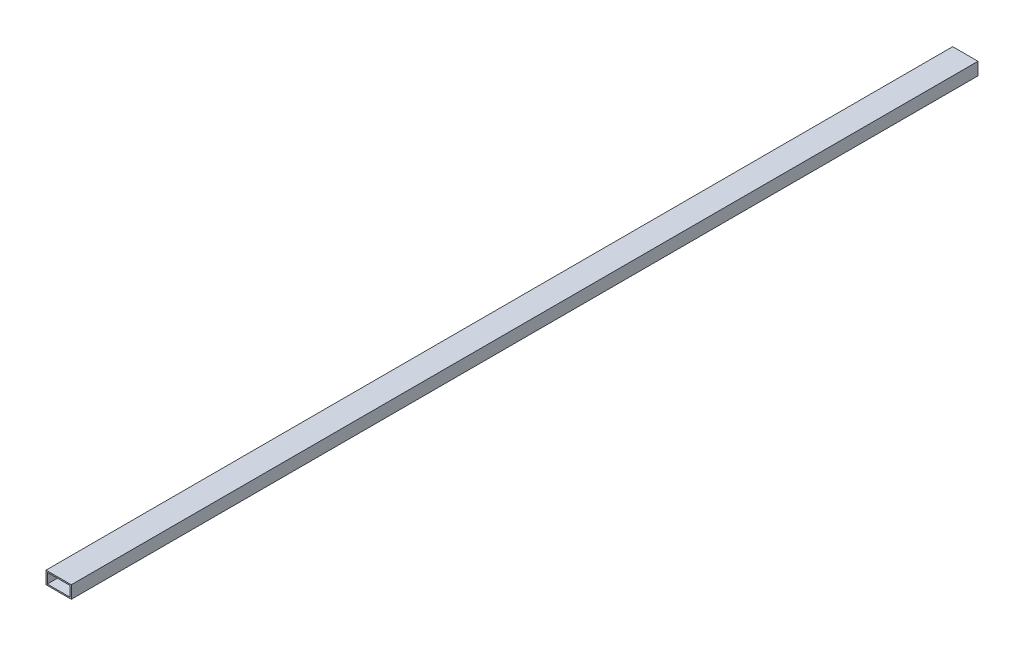
ISO-10303-21;
HEADER;
FILE_DESCRIPTION(('STEP AP214'),'2;1');
FILE_NAME('part.step','',(''),(''),'','','');
FILE_SCHEMA(('AUTOMOTIVE_DESIGN { 1 0 10303 214 1 1 1 1 }'));
ENDSEC;
DATA;
#1=APPLICATION_CONTEXT('core data for automotive mechanical design processes');
#2=APPLICATION_PROTOCOL_DEFINITION('international standard','automotive_design',2000,#1);
#3=PRODUCT_CONTEXT('',#1,'mechanical');
#4=PRODUCT('Part','Part','',(#3));
#5=PRODUCT_RELATED_PRODUCT_CATEGORY('part','',(#4));
#6=PRODUCT_DEFINITION_FORMATION('','',#4);
#7=PRODUCT_DEFINITION_CONTEXT('part definition',#1,'design');
#8=PRODUCT_DEFINITION('design','',#6,#7);
#9=PRODUCT_DEFINITION_SHAPE('','',#8);
#10=(LENGTH_UNIT() NAMED_UNIT(*) SI_UNIT(.MILLI.,.METRE.));
#11=(NAMED_UNIT(*) PLANE_ANGLE_UNIT() SI_UNIT($,.RADIAN.));
#12=(NAMED_UNIT(*) SI_UNIT($,.STERADIAN.) SOLID_ANGLE_UNIT());
#13=UNCERTAINTY_MEASURE_WITH_UNIT(LENGTH_MEASURE(1.E-05),#10,'distance_accuracy_value','');
#14=(GEOMETRIC_REPRESENTATION_CONTEXT(3) GLOBAL_UNCERTAINTY_ASSIGNED_CONTEXT((#13)) GLOBAL_UNIT_ASSIGNED_CONTEXT((#10,
#11,#12)) REPRESENTATION_CONTEXT('',''));
#15=CARTESIAN_POINT('',(0.,0.,0.));
#16=DIRECTION('',(0.,0.,1.));
#17=DIRECTION('',(1.,0.,0.));
#18=AXIS2_PLACEMENT_3D('',#15,#16,#17);
#19=CARTESIAN_POINT('',(-20.,-10.,1433.));
#20=DIRECTION('',(0.,0.,1.));
#21=DIRECTION('',(1.,0.,0.));
#22=AXIS2_PLACEMENT_3D('',#19,#20,#21);
#23=PLANE('',#22);
#24=DIRECTION('',(0.,-1.,0.));
#25=VECTOR('',#24,1.);
#26=CARTESIAN_POINT('',(-20.,-10.,1433.));
#27=LINE('',#26,#25);
#28=CARTESIAN_POINT('',(-20.,10.,1433.));
#29=VERTEX_POINT('',#28);
#30=CARTESIAN_POINT('',(-20.,-10.,1433.));
#31=VERTEX_POINT('',#30);
#32=EDGE_CURVE('E156',#29,#31,#27,.T.);
#33=ORIENTED_EDGE('',*,*,#32,.T.);
#34=DIRECTION('',(1.,0.,0.));
#35=VECTOR('',#34,1.);
#36=CARTESIAN_POINT('',(20.,-10.,1433.));
#37=LINE('',#36,#35);
#38=CARTESIAN_POINT('',(20.,-10.,1433.));
#39=VERTEX_POINT('',#38);
#40=EDGE_CURVE('E159',#31,#39,#37,.T.);
#41=ORIENTED_EDGE('',*,*,#40,.T.);
#42=DIRECTION('',(0.,1.,0.));
#43=VECTOR('',#42,1.);
#44=CARTESIAN_POINT('',(20.,-10.,1433.));
#45=LINE('',#44,#43);
#46=CARTESIAN_POINT('',(20.,10.,1433.));
#47=VERTEX_POINT('',#46);
#48=EDGE_CURVE('E162',#39,#47,#45,.T.);
#49=ORIENTED_EDGE('',*,*,#48,.T.);
#50=DIRECTION('',(-1.,0.,0.));
#51=VECTOR('',#50,1.);
#52=CARTESIAN_POINT('',(20.,10.,1433.));
#53=LINE('',#52,#51);
#54=EDGE_CURVE('E164',#47,#29,#53,.T.);
#55=ORIENTED_EDGE('',*,*,#54,.T.);
#56=EDGE_LOOP('',(#33,#41,#49,#55));
#57=FACE_BOUND('',#56,.T.);
#58=DIRECTION('',(1.,0.,0.));
#59=VECTOR('',#58,1.);
#60=CARTESIAN_POINT('',(20.,-8.,1433.));
#61=LINE('',#60,#59);
#62=CARTESIAN_POINT('',(-18.,-8.,1433.));
#63=VERTEX_POINT('',#62);
#64=CARTESIAN_POINT('',(18.,-8.,1433.));
#65=VERTEX_POINT('',#64);
#66=EDGE_CURVE('E128',#63,#65,#61,.T.);
#67=ORIENTED_EDGE('',*,*,#66,.F.);
#68=DIRECTION('',(0.,-1.,0.));
#69=VECTOR('',#68,1.);
#70=CARTESIAN_POINT('',(-18.,-10.,1433.));
#71=LINE('',#70,#69);
#72=CARTESIAN_POINT('',(-18.,8.,1433.));
#73=VERTEX_POINT('',#72);
#74=EDGE_CURVE('E120',#73,#63,#71,.T.);
#75=ORIENTED_EDGE('',*,*,#74,.F.);
#76=DIRECTION('',(-1.,0.,0.));
#77=VECTOR('',#76,1.);
#78=CARTESIAN_POINT('',(20.,8.,1433.));
#79=LINE('',#78,#77);
#80=CARTESIAN_POINT('',(18.,8.,1433.));
#81=VERTEX_POINT('',#80);
#82=EDGE_CURVE('E142',#81,#73,#79,.T.);
#83=ORIENTED_EDGE('',*,*,#82,.F.);
#84=DIRECTION('',(0.,1.,0.));
#85=VECTOR('',#84,1.);
#86=CARTESIAN_POINT('',(18.,-10.,1433.));
#87=LINE('',#86,#85);
#88=EDGE_CURVE('E140',#65,#81,#87,.T.);
#89=ORIENTED_EDGE('',*,*,#88,.F.);
#90=EDGE_LOOP('',(#67,#75,#83,#89));
#91=FACE_BOUND('',#90,.T.);
#92=ADVANCED_FACE('F55',(#57,#91),#23,.T.);
#93=CARTESIAN_POINT('',(-20.,-10.,0.));
#94=DIRECTION('',(0.,0.,1.));
#95=DIRECTION('',(1.,0.,0.));
#96=AXIS2_PLACEMENT_3D('',#93,#94,#95);
#97=PLANE('',#96);
#98=DIRECTION('',(0.,-1.,0.));
#99=VECTOR('',#98,1.);
#100=CARTESIAN_POINT('',(-20.,-10.,0.));
#101=LINE('',#100,#99);
#102=CARTESIAN_POINT('',(-20.,10.,0.));
#103=VERTEX_POINT('',#102);
#104=CARTESIAN_POINT('',(-20.,-10.,0.));
#105=VERTEX_POINT('',#104);
#106=EDGE_CURVE('E136',#103,#105,#101,.T.);
#107=ORIENTED_EDGE('',*,*,#106,.F.);
#108=DIRECTION('',(-1.,0.,0.));
#109=VECTOR('',#108,1.);
#110=CARTESIAN_POINT('',(20.,10.,0.));
#111=LINE('',#110,#109);
#112=CARTESIAN_POINT('',(20.,10.,0.));
#113=VERTEX_POINT('',#112);
#114=EDGE_CURVE('E160',#113,#103,#111,.T.);
#115=ORIENTED_EDGE('',*,*,#114,.F.);
#116=DIRECTION('',(0.,1.,0.));
#117=VECTOR('',#116,1.);
#118=CARTESIAN_POINT('',(20.,-10.,0.));
#119=LINE('',#118,#117);
#120=CARTESIAN_POINT('',(20.,-10.,0.));
#121=VERTEX_POINT('',#120);
#122=EDGE_CURVE('E171',#121,#113,#119,.T.);
#123=ORIENTED_EDGE('',*,*,#122,.F.);
#124=DIRECTION('',(1.,0.,0.));
#125=VECTOR('',#124,1.);
#126=CARTESIAN_POINT('',(20.,-10.,0.));
#127=LINE('',#126,#125);
#128=EDGE_CURVE('E169',#105,#121,#127,.T.);
#129=ORIENTED_EDGE('',*,*,#128,.F.);
#130=EDGE_LOOP('',(#107,#115,#123,#129));
#131=FACE_BOUND('',#130,.T.);
#132=DIRECTION('',(0.,-1.,0.));
#133=VECTOR('',#132,1.);
#134=CARTESIAN_POINT('',(-18.,-10.,0.));
#135=LINE('',#134,#133);
#136=CARTESIAN_POINT('',(-18.,8.,0.));
#137=VERTEX_POINT('',#136);
#138=CARTESIAN_POINT('',(-18.,-8.,0.));
#139=VERTEX_POINT('',#138);
#140=EDGE_CURVE('E78',#137,#139,#135,.T.);
#141=ORIENTED_EDGE('',*,*,#140,.T.);
#142=DIRECTION('',(1.,0.,0.));
#143=VECTOR('',#142,1.);
#144=CARTESIAN_POINT('',(20.,-8.,0.));
#145=LINE('',#144,#143);
#146=CARTESIAN_POINT('',(18.,-8.,0.));
#147=VERTEX_POINT('',#146);
#148=EDGE_CURVE('E135',#139,#147,#145,.T.);
#149=ORIENTED_EDGE('',*,*,#148,.T.);
#150=DIRECTION('',(0.,1.,0.));
#151=VECTOR('',#150,1.);
#152=CARTESIAN_POINT('',(18.,-10.,0.));
#153=LINE('',#152,#151);
#154=CARTESIAN_POINT('',(18.,8.,0.));
#155=VERTEX_POINT('',#154);
#156=EDGE_CURVE('E148',#147,#155,#153,.T.);
#157=ORIENTED_EDGE('',*,*,#156,.T.);
#158=DIRECTION('',(-1.,0.,0.));
#159=VECTOR('',#158,1.);
#160=CARTESIAN_POINT('',(20.,8.,0.));
#161=LINE('',#160,#159);
#162=EDGE_CURVE('E129',#155,#137,#161,.T.);
#163=ORIENTED_EDGE('',*,*,#162,.T.);
#164=EDGE_LOOP('',(#141,#149,#157,#163));
#165=FACE_BOUND('',#164,.T.);
#166=ADVANCED_FACE('F189',(#131,#165),#97,.F.);
#167=CARTESIAN_POINT('',(-20.,-10.,1433.));
#168=DIRECTION('',(1.,0.,0.));
#169=DIRECTION('',(0.,0.,-1.));
#170=AXIS2_PLACEMENT_3D('',#167,#168,#169);
#171=PLANE('',#170);
#172=ORIENTED_EDGE('',*,*,#106,.T.);
#173=DIRECTION('',(0.,0.,-1.));
#174=VECTOR('',#173,1.);
#175=CARTESIAN_POINT('',(-20.,-10.,1433.));
#176=LINE('',#175,#174);
#177=EDGE_CURVE('E12',#31,#105,#176,.T.);
#178=ORIENTED_EDGE('',*,*,#177,.F.);
#179=ORIENTED_EDGE('',*,*,#32,.F.);
#180=DIRECTION('',(0.,0.,-1.));
#181=VECTOR('',#180,1.);
#182=CARTESIAN_POINT('',(-20.,10.,1433.));
#183=LINE('',#182,#181);
#184=EDGE_CURVE('E166',#29,#103,#183,.T.);
#185=ORIENTED_EDGE('',*,*,#184,.T.);
#186=EDGE_LOOP('',(#172,#178,#179,#185));
#187=FACE_BOUND('',#186,.T.);
#188=ADVANCED_FACE('F57',(#187),#171,.F.);
#189=CARTESIAN_POINT('',(20.,-10.,1433.));
#190=DIRECTION('',(0.,1.,0.));
#191=DIRECTION('',(0.,0.,1.));
#192=AXIS2_PLACEMENT_3D('',#189,#190,#191);
#193=PLANE('',#192);
#194=ORIENTED_EDGE('',*,*,#128,.T.);
#195=DIRECTION('',(0.,0.,-1.));
#196=VECTOR('',#195,1.);
#197=CARTESIAN_POINT('',(20.,-10.,1433.));
#198=LINE('',#197,#196);
#199=EDGE_CURVE('E63',#39,#121,#198,.T.);
#200=ORIENTED_EDGE('',*,*,#199,.F.);
#201=ORIENTED_EDGE('',*,*,#40,.F.);
#202=ORIENTED_EDGE('',*,*,#177,.T.);
#203=EDGE_LOOP('',(#194,#200,#201,#202));
#204=FACE_BOUND('',#203,.T.);
#205=ADVANCED_FACE('F199',(#204),#193,.F.);
#206=CARTESIAN_POINT('',(20.,-10.,1433.));
#207=DIRECTION('',(-1.,0.,0.));
#208=DIRECTION('',(0.,0.,1.));
#209=AXIS2_PLACEMENT_3D('',#206,#207,#208);
#210=PLANE('',#209);
#211=ORIENTED_EDGE('',*,*,#122,.T.);
#212=DIRECTION('',(0.,0.,-1.));
#213=VECTOR('',#212,1.);
#214=CARTESIAN_POINT('',(20.,10.,1433.));
#215=LINE('',#214,#213);
#216=EDGE_CURVE('E176',#47,#113,#215,.T.);
#217=ORIENTED_EDGE('',*,*,#216,.F.);
#218=ORIENTED_EDGE('',*,*,#48,.F.);
#219=ORIENTED_EDGE('',*,*,#199,.T.);
#220=EDGE_LOOP('',(#211,#217,#218,#219));
#221=FACE_BOUND('',#220,.T.);
#222=ADVANCED_FACE('F183',(#221),#210,.F.);
#223=CARTESIAN_POINT('',(20.,10.,1433.));
#224=DIRECTION('',(0.,-1.,0.));
#225=DIRECTION('',(1.,0.,0.));
#226=AXIS2_PLACEMENT_3D('',#223,#224,#225);
#227=PLANE('',#226);
#228=ORIENTED_EDGE('',*,*,#114,.T.);
#229=ORIENTED_EDGE('',*,*,#184,.F.);
#230=ORIENTED_EDGE('',*,*,#54,.F.);
#231=ORIENTED_EDGE('',*,*,#216,.T.);
#232=EDGE_LOOP('',(#228,#229,#230,#231));
#233=FACE_BOUND('',#232,.T.);
#234=ADVANCED_FACE('F193',(#233),#227,.F.);
#235=CARTESIAN_POINT('',(-18.,-10.,1433.));
#236=DIRECTION('',(1.,0.,0.));
#237=DIRECTION('',(0.,0.,-1.));
#238=AXIS2_PLACEMENT_3D('',#235,#236,#237);
#239=PLANE('',#238);
#240=ORIENTED_EDGE('',*,*,#140,.F.);
#241=DIRECTION('',(0.,0.,-1.));
#242=VECTOR('',#241,1.);
#243=CARTESIAN_POINT('',(-18.,8.,1433.));
#244=LINE('',#243,#242);
#245=EDGE_CURVE('E124',#73,#137,#244,.T.);
#246=ORIENTED_EDGE('',*,*,#245,.F.);
#247=ORIENTED_EDGE('',*,*,#74,.T.);
#248=DIRECTION('',(0.,0.,-1.));
#249=VECTOR('',#248,1.);
#250=CARTESIAN_POINT('',(-18.,-8.,1433.));
#251=LINE('',#250,#249);
#252=EDGE_CURVE('E123',#63,#139,#251,.T.);
#253=ORIENTED_EDGE('',*,*,#252,.T.);
#254=EDGE_LOOP('',(#240,#246,#247,#253));
#255=FACE_BOUND('',#254,.T.);
#256=ADVANCED_FACE('F122',(#255),#239,.T.);
#257=CARTESIAN_POINT('',(20.,-8.,1433.));
#258=DIRECTION('',(0.,1.,0.));
#259=DIRECTION('',(0.,0.,1.));
#260=AXIS2_PLACEMENT_3D('',#257,#258,#259);
#261=PLANE('',#260);
#262=ORIENTED_EDGE('',*,*,#148,.F.);
#263=ORIENTED_EDGE('',*,*,#252,.F.);
#264=ORIENTED_EDGE('',*,*,#66,.T.);
#265=DIRECTION('',(0.,0.,-1.));
#266=VECTOR('',#265,1.);
#267=CARTESIAN_POINT('',(18.,-8.,1433.));
#268=LINE('',#267,#266);
#269=EDGE_CURVE('E137',#65,#147,#268,.T.);
#270=ORIENTED_EDGE('',*,*,#269,.T.);
#271=EDGE_LOOP('',(#262,#263,#264,#270));
#272=FACE_BOUND('',#271,.T.);
#273=ADVANCED_FACE('F132',(#272),#261,.T.);
#274=CARTESIAN_POINT('',(18.,-10.,1433.));
#275=DIRECTION('',(-1.,0.,0.));
#276=DIRECTION('',(0.,0.,1.));
#277=AXIS2_PLACEMENT_3D('',#274,#275,#276);
#278=PLANE('',#277);
#279=ORIENTED_EDGE('',*,*,#156,.F.);
#280=ORIENTED_EDGE('',*,*,#269,.F.);
#281=ORIENTED_EDGE('',*,*,#88,.T.);
#282=DIRECTION('',(0.,0.,-1.));
#283=VECTOR('',#282,1.);
#284=CARTESIAN_POINT('',(18.,8.,1433.));
#285=LINE('',#284,#283);
#286=EDGE_CURVE('E70',#81,#155,#285,.T.);
#287=ORIENTED_EDGE('',*,*,#286,.T.);
#288=EDGE_LOOP('',(#279,#280,#281,#287));
#289=FACE_BOUND('',#288,.T.);
#290=ADVANCED_FACE('F222',(#289),#278,.T.);
#291=CARTESIAN_POINT('',(20.,8.,1433.));
#292=DIRECTION('',(0.,-1.,0.));
#293=DIRECTION('',(1.,0.,0.));
#294=AXIS2_PLACEMENT_3D('',#291,#292,#293);
#295=PLANE('',#294);
#296=ORIENTED_EDGE('',*,*,#162,.F.);
#297=ORIENTED_EDGE('',*,*,#286,.F.);
#298=ORIENTED_EDGE('',*,*,#82,.T.);
#299=ORIENTED_EDGE('',*,*,#245,.T.);
#300=EDGE_LOOP('',(#296,#297,#298,#299));
#301=FACE_BOUND('',#300,.T.);
#302=ADVANCED_FACE('F226',(#301),#295,.T.);
#303=CLOSED_SHELL('',(#92,#166,#188,#205,#222,#234,#256,#273,#290,#302));
#304=MANIFOLD_SOLID_BREP('B2',#303);
#305=ADVANCED_BREP_SHAPE_REPRESENTATION('',(#18,#304),#14);
#306=SHAPE_DEFINITION_REPRESENTATION(#9,#305);
ENDSEC;
END-ISO-10303-21;
